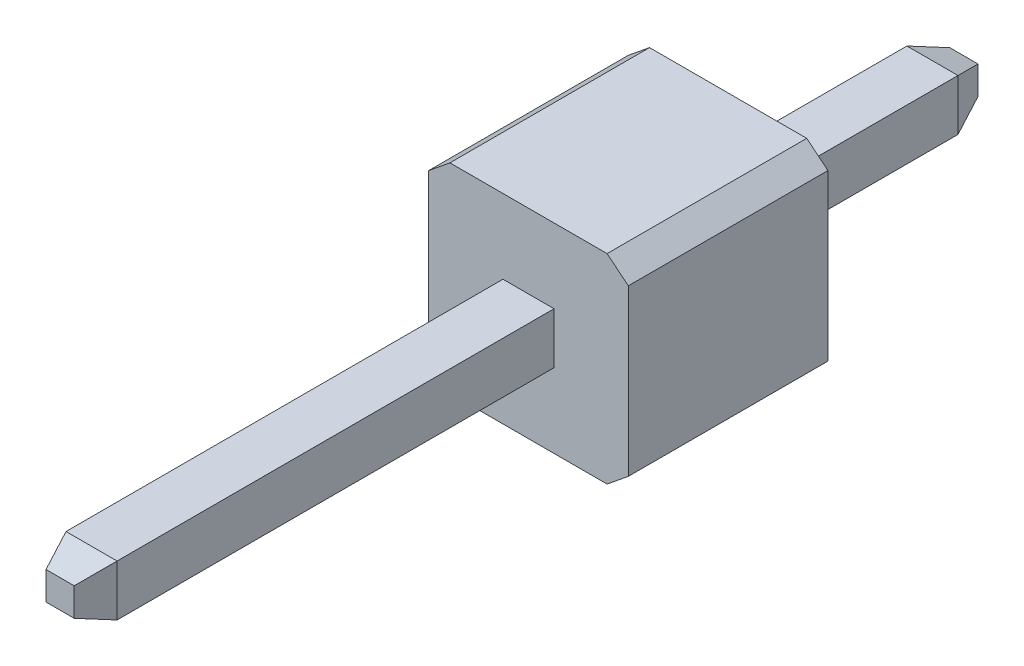
ISO-10303-21;
HEADER;
FILE_DESCRIPTION(('STEP AP214'),'2;1');
FILE_NAME('part.step','',(''),(''),'','','');
FILE_SCHEMA(('AUTOMOTIVE_DESIGN { 1 0 10303 214 1 1 1 1 }'));
ENDSEC;
DATA;
#1=APPLICATION_CONTEXT('core data for automotive mechanical design processes');
#2=APPLICATION_PROTOCOL_DEFINITION('international standard','automotive_design',2000,#1);
#3=PRODUCT_CONTEXT('',#1,'mechanical');
#4=PRODUCT('Part','Part','',(#3));
#5=PRODUCT_RELATED_PRODUCT_CATEGORY('part','',(#4));
#6=PRODUCT_DEFINITION_FORMATION('','',#4);
#7=PRODUCT_DEFINITION_CONTEXT('part definition',#1,'design');
#8=PRODUCT_DEFINITION('design','',#6,#7);
#9=PRODUCT_DEFINITION_SHAPE('','',#8);
#10=(LENGTH_UNIT() NAMED_UNIT(*) SI_UNIT(.MILLI.,.METRE.));
#11=(NAMED_UNIT(*) PLANE_ANGLE_UNIT() SI_UNIT($,.RADIAN.));
#12=(NAMED_UNIT(*) SI_UNIT($,.STERADIAN.) SOLID_ANGLE_UNIT());
#13=UNCERTAINTY_MEASURE_WITH_UNIT(LENGTH_MEASURE(1.E-05),#10,'distance_accuracy_value','');
#14=(GEOMETRIC_REPRESENTATION_CONTEXT(3) GLOBAL_UNCERTAINTY_ASSIGNED_CONTEXT((#13)) GLOBAL_UNIT_ASSIGNED_CONTEXT((#10,
#11,#12)) REPRESENTATION_CONTEXT('',''));
#15=CARTESIAN_POINT('',(0.,0.,0.));
#16=DIRECTION('',(0.,0.,1.));
#17=DIRECTION('',(1.,0.,0.));
#18=AXIS2_PLACEMENT_3D('',#15,#16,#17);
#19=CARTESIAN_POINT('',(-0.325,0.325,11.5));
#20=DIRECTION('',(1.,0.,0.));
#21=DIRECTION('',(0.,1.,0.));
#22=AXIS2_PLACEMENT_3D('',#19,#20,#21);
#23=PLANE('',#22);
#24=DIRECTION('',(0.,-1.,0.));
#25=VECTOR('',#24,1.);
#26=CARTESIAN_POINT('',(-0.325,0.325,3.));
#27=LINE('',#26,#25);
#28=CARTESIAN_POINT('',(-0.325,0.325,3.));
#29=VERTEX_POINT('',#28);
#30=CARTESIAN_POINT('',(-0.325,-0.325,3.));
#31=VERTEX_POINT('',#30);
#32=EDGE_CURVE('E239',#29,#31,#27,.T.);
#33=ORIENTED_EDGE('',*,*,#32,.F.);
#34=DIRECTION('',(0.,0.,-1.));
#35=VECTOR('',#34,1.);
#36=CARTESIAN_POINT('',(-0.325,0.325,11.5));
#37=LINE('',#36,#35);
#38=CARTESIAN_POINT('',(-0.325,0.325,0.4));
#39=VERTEX_POINT('',#38);
#40=EDGE_CURVE('E20',#29,#39,#37,.T.);
#41=ORIENTED_EDGE('',*,*,#40,.T.);
#42=DIRECTION('',(0.,-1.,0.));
#43=VECTOR('',#42,1.);
#44=CARTESIAN_POINT('',(-0.325,0.325,0.4));
#45=LINE('',#44,#43);
#46=CARTESIAN_POINT('',(-0.325,-0.325,0.4));
#47=VERTEX_POINT('',#46);
#48=EDGE_CURVE('E259',#39,#47,#45,.T.);
#49=ORIENTED_EDGE('',*,*,#48,.T.);
#50=DIRECTION('',(0.,0.,-1.));
#51=VECTOR('',#50,1.);
#52=CARTESIAN_POINT('',(-0.325,-0.325,11.5));
#53=LINE('',#52,#51);
#54=EDGE_CURVE('E11',#31,#47,#53,.T.);
#55=ORIENTED_EDGE('',*,*,#54,.F.);
#56=EDGE_LOOP('',(#33,#41,#49,#55));
#57=FACE_BOUND('',#56,.T.);
#58=ADVANCED_FACE('F16',(#57),#23,.F.);
#59=CARTESIAN_POINT('',(-0.325,-0.325,11.5));
#60=DIRECTION('',(0.,1.,0.));
#61=DIRECTION('',(1.,0.,0.));
#62=AXIS2_PLACEMENT_3D('',#59,#60,#61);
#63=PLANE('',#62);
#64=DIRECTION('',(1.,0.,0.));
#65=VECTOR('',#64,1.);
#66=CARTESIAN_POINT('',(-0.325,-0.325,3.));
#67=LINE('',#66,#65);
#68=CARTESIAN_POINT('',(0.325,-0.325,3.));
#69=VERTEX_POINT('',#68);
#70=EDGE_CURVE('E233',#31,#69,#67,.T.);
#71=ORIENTED_EDGE('',*,*,#70,.F.);
#72=ORIENTED_EDGE('',*,*,#54,.T.);
#73=DIRECTION('',(1.,0.,0.));
#74=VECTOR('',#73,1.);
#75=CARTESIAN_POINT('',(-0.325,-0.325,0.4));
#76=LINE('',#75,#74);
#77=CARTESIAN_POINT('',(0.325,-0.325,0.4));
#78=VERTEX_POINT('',#77);
#79=EDGE_CURVE('E385',#47,#78,#76,.T.);
#80=ORIENTED_EDGE('',*,*,#79,.T.);
#81=DIRECTION('',(0.,0.,-1.));
#82=VECTOR('',#81,1.);
#83=CARTESIAN_POINT('',(0.325,-0.325,11.5));
#84=LINE('',#83,#82);
#85=EDGE_CURVE('E27',#69,#78,#84,.T.);
#86=ORIENTED_EDGE('',*,*,#85,.F.);
#87=EDGE_LOOP('',(#71,#72,#80,#86));
#88=FACE_BOUND('',#87,.T.);
#89=ADVANCED_FACE('F464',(#88),#63,.F.);
#90=CARTESIAN_POINT('',(0.325,0.325,11.5));
#91=DIRECTION('',(-1.,0.,0.));
#92=DIRECTION('',(0.,1.,0.));
#93=AXIS2_PLACEMENT_3D('',#90,#91,#92);
#94=PLANE('',#93);
#95=DIRECTION('',(0.,1.,0.));
#96=VECTOR('',#95,1.);
#97=CARTESIAN_POINT('',(0.325,0.325,3.));
#98=LINE('',#97,#96);
#99=CARTESIAN_POINT('',(0.325,0.325,3.));
#100=VERTEX_POINT('',#99);
#101=EDGE_CURVE('E218',#69,#100,#98,.T.);
#102=ORIENTED_EDGE('',*,*,#101,.F.);
#103=ORIENTED_EDGE('',*,*,#85,.T.);
#104=DIRECTION('',(0.,1.,0.));
#105=VECTOR('',#104,1.);
#106=CARTESIAN_POINT('',(0.325,0.325,0.4));
#107=LINE('',#106,#105);
#108=CARTESIAN_POINT('',(0.325,0.325,0.4));
#109=VERTEX_POINT('',#108);
#110=EDGE_CURVE('E221',#78,#109,#107,.T.);
#111=ORIENTED_EDGE('',*,*,#110,.T.);
#112=DIRECTION('',(0.,0.,-1.));
#113=VECTOR('',#112,1.);
#114=CARTESIAN_POINT('',(0.325,0.325,11.5));
#115=LINE('',#114,#113);
#116=EDGE_CURVE('E41',#100,#109,#115,.T.);
#117=ORIENTED_EDGE('',*,*,#116,.F.);
#118=EDGE_LOOP('',(#102,#103,#111,#117));
#119=FACE_BOUND('',#118,.T.);
#120=ADVANCED_FACE('F217',(#119),#94,.F.);
#121=CARTESIAN_POINT('',(-0.325,0.325,11.5));
#122=DIRECTION('',(0.,-1.,0.));
#123=DIRECTION('',(0.,0.,-1.));
#124=AXIS2_PLACEMENT_3D('',#121,#122,#123);
#125=PLANE('',#124);
#126=DIRECTION('',(-1.,0.,0.));
#127=VECTOR('',#126,1.);
#128=CARTESIAN_POINT('',(-0.325,0.325,3.));
#129=LINE('',#128,#127);
#130=EDGE_CURVE('E231',#100,#29,#129,.T.);
#131=ORIENTED_EDGE('',*,*,#130,.F.);
#132=ORIENTED_EDGE('',*,*,#116,.T.);
#133=DIRECTION('',(-1.,0.,0.));
#134=VECTOR('',#133,1.);
#135=CARTESIAN_POINT('',(-0.325,0.325,0.4));
#136=LINE('',#135,#134);
#137=EDGE_CURVE('E224',#109,#39,#136,.T.);
#138=ORIENTED_EDGE('',*,*,#137,.T.);
#139=ORIENTED_EDGE('',*,*,#40,.F.);
#140=EDGE_LOOP('',(#131,#132,#138,#139));
#141=FACE_BOUND('',#140,.T.);
#142=ADVANCED_FACE('F237',(#141),#125,.F.);
#143=CARTESIAN_POINT('',(-0.325,0.325,0.4));
#144=DIRECTION('',(0.,-0.93969262078591,0.342020143325665));
#145=DIRECTION('',(-1.,0.,0.));
#146=AXIS2_PLACEMENT_3D('',#143,#144,#145);
#147=PLANE('',#146);
#148=DIRECTION('',(0.323615577118182,0.323615577118182,0.889126490715991));
#149=VECTOR('',#148,1.);
#150=CARTESIAN_POINT('',(0.256927422860203,0.256927422860203,0.212972131424324));
#151=LINE('',#150,#149);
#152=CARTESIAN_POINT('',(0.17941190629352,0.17941190629352,0.));
#153=VERTEX_POINT('',#152);
#154=EDGE_CURVE('E386',#153,#109,#151,.T.);
#155=ORIENTED_EDGE('',*,*,#154,.F.);
#156=DIRECTION('',(1.,0.,0.));
#157=VECTOR('',#156,1.);
#158=CARTESIAN_POINT('',(0.,0.17941190629352,0.));
#159=LINE('',#158,#157);
#160=CARTESIAN_POINT('',(-0.17941190629352,0.17941190629352,0.));
#161=VERTEX_POINT('',#160);
#162=EDGE_CURVE('E378',#161,#153,#159,.T.);
#163=ORIENTED_EDGE('',*,*,#162,.F.);
#164=DIRECTION('',(0.323615577118182,-0.323615577118182,-0.889126490715991));
#165=VECTOR('',#164,1.);
#166=CARTESIAN_POINT('',(-0.325,0.325,0.4));
#167=LINE('',#166,#165);
#168=EDGE_CURVE('E186',#39,#161,#167,.T.);
#169=ORIENTED_EDGE('',*,*,#168,.F.);
#170=ORIENTED_EDGE('',*,*,#137,.F.);
#171=EDGE_LOOP('',(#155,#163,#169,#170));
#172=FACE_BOUND('',#171,.T.);
#173=ADVANCED_FACE('F487',(#172),#147,.F.);
#174=CARTESIAN_POINT('',(0.325,0.325,0.4));
#175=DIRECTION('',(-0.93969262078591,0.,0.342020143325665));
#176=DIRECTION('',(0.,1.,0.));
#177=AXIS2_PLACEMENT_3D('',#174,#175,#176);
#178=PLANE('',#177);
#179=ORIENTED_EDGE('',*,*,#154,.T.);
#180=ORIENTED_EDGE('',*,*,#110,.F.);
#181=DIRECTION('',(0.323615577118182,-0.323615577118182,0.889126490715991));
#182=VECTOR('',#181,1.);
#183=CARTESIAN_POINT('',(0.256927422860203,-0.256927422860203,0.212972131424324));
#184=LINE('',#183,#182);
#185=CARTESIAN_POINT('',(0.179411906293521,-0.17941190629352,0.));
#186=VERTEX_POINT('',#185);
#187=EDGE_CURVE('E262',#186,#78,#184,.T.);
#188=ORIENTED_EDGE('',*,*,#187,.F.);
#189=DIRECTION('',(0.,-1.,0.));
#190=VECTOR('',#189,1.);
#191=CARTESIAN_POINT('',(0.17941190629352,0.,0.));
#192=LINE('',#191,#190);
#193=EDGE_CURVE('E253',#153,#186,#192,.T.);
#194=ORIENTED_EDGE('',*,*,#193,.F.);
#195=EDGE_LOOP('',(#179,#180,#188,#194));
#196=FACE_BOUND('',#195,.T.);
#197=ADVANCED_FACE('F484',(#196),#178,.F.);
#198=CARTESIAN_POINT('',(-0.325,-0.325,0.4));
#199=DIRECTION('',(0.,0.93969262078591,0.342020143325665));
#200=DIRECTION('',(1.,0.,0.));
#201=AXIS2_PLACEMENT_3D('',#198,#199,#200);
#202=PLANE('',#201);
#203=DIRECTION('',(0.323615577118182,0.323615577118182,-0.889126490715991));
#204=VECTOR('',#203,1.);
#205=CARTESIAN_POINT('',(-0.256927422860203,-0.256927422860203,0.212972131424324));
#206=LINE('',#205,#204);
#207=CARTESIAN_POINT('',(-0.17941190629352,-0.17941190629352,0.));
#208=VERTEX_POINT('',#207);
#209=EDGE_CURVE('E177',#47,#208,#206,.T.);
#210=ORIENTED_EDGE('',*,*,#209,.T.);
#211=DIRECTION('',(-1.,0.,0.));
#212=VECTOR('',#211,1.);
#213=CARTESIAN_POINT('',(0.,-0.17941190629352,0.));
#214=LINE('',#213,#212);
#215=EDGE_CURVE('E257',#186,#208,#214,.T.);
#216=ORIENTED_EDGE('',*,*,#215,.F.);
#217=ORIENTED_EDGE('',*,*,#187,.T.);
#218=ORIENTED_EDGE('',*,*,#79,.F.);
#219=EDGE_LOOP('',(#210,#216,#217,#218));
#220=FACE_BOUND('',#219,.T.);
#221=ADVANCED_FACE('F471',(#220),#202,.F.);
#222=CARTESIAN_POINT('',(-0.325,0.325,0.4));
#223=DIRECTION('',(0.93969262078591,0.,0.342020143325665));
#224=DIRECTION('',(0.,-1.,0.));
#225=AXIS2_PLACEMENT_3D('',#222,#223,#224);
#226=PLANE('',#225);
#227=ORIENTED_EDGE('',*,*,#168,.T.);
#228=DIRECTION('',(0.,1.,0.));
#229=VECTOR('',#228,1.);
#230=CARTESIAN_POINT('',(-0.17941190629352,0.,0.));
#231=LINE('',#230,#229);
#232=EDGE_CURVE('E426',#208,#161,#231,.T.);
#233=ORIENTED_EDGE('',*,*,#232,.F.);
#234=ORIENTED_EDGE('',*,*,#209,.F.);
#235=ORIENTED_EDGE('',*,*,#48,.F.);
#236=EDGE_LOOP('',(#227,#233,#234,#235));
#237=FACE_BOUND('',#236,.T.);
#238=ADVANCED_FACE('F18',(#237),#226,.F.);
#239=CARTESIAN_POINT('',(0.,0.,0.));
#240=DIRECTION('',(0.,0.,1.));
#241=DIRECTION('',(1.,0.,0.));
#242=AXIS2_PLACEMENT_3D('',#239,#240,#241);
#243=PLANE('',#242);
#244=ORIENTED_EDGE('',*,*,#193,.T.);
#245=ORIENTED_EDGE('',*,*,#215,.T.);
#246=ORIENTED_EDGE('',*,*,#232,.T.);
#247=ORIENTED_EDGE('',*,*,#162,.T.);
#248=EDGE_LOOP('',(#244,#245,#246,#247));
#249=FACE_BOUND('',#248,.T.);
#250=ADVANCED_FACE('F504',(#249),#243,.F.);
#251=CARTESIAN_POINT('',(1.27,-1.05,5.54));
#252=DIRECTION('',(1.,0.,0.));
#253=DIRECTION('',(0.,1.,0.));
#254=AXIS2_PLACEMENT_3D('',#251,#252,#253);
#255=PLANE('',#254);
#256=DIRECTION('',(0.,-1.,0.));
#257=VECTOR('',#256,1.);
#258=CARTESIAN_POINT('',(1.27,-1.05,3.));
#259=LINE('',#258,#257);
#260=CARTESIAN_POINT('',(1.27,1.05,3.));
#261=VERTEX_POINT('',#260);
#262=CARTESIAN_POINT('',(1.27,-1.05,3.));
#263=VERTEX_POINT('',#262);
#264=EDGE_CURVE('E315',#261,#263,#259,.T.);
#265=ORIENTED_EDGE('',*,*,#264,.F.);
#266=DIRECTION('',(0.,0.,-1.));
#267=VECTOR('',#266,1.);
#268=CARTESIAN_POINT('',(1.27,1.05,5.54));
#269=LINE('',#268,#267);
#270=CARTESIAN_POINT('',(1.27,1.05,5.54));
#271=VERTEX_POINT('',#270);
#272=EDGE_CURVE('E430',#271,#261,#269,.T.);
#273=ORIENTED_EDGE('',*,*,#272,.F.);
#274=DIRECTION('',(0.,-1.,0.));
#275=VECTOR('',#274,1.);
#276=CARTESIAN_POINT('',(1.27,-1.05,5.54));
#277=LINE('',#276,#275);
#278=CARTESIAN_POINT('',(1.27,-1.05,5.54));
#279=VERTEX_POINT('',#278);
#280=EDGE_CURVE('E371',#271,#279,#277,.T.);
#281=ORIENTED_EDGE('',*,*,#280,.T.);
#282=DIRECTION('',(0.,0.,-1.));
#283=VECTOR('',#282,1.);
#284=CARTESIAN_POINT('',(1.27,-1.05,5.54));
#285=LINE('',#284,#283);
#286=EDGE_CURVE('E258',#279,#263,#285,.T.);
#287=ORIENTED_EDGE('',*,*,#286,.T.);
#288=EDGE_LOOP('',(#265,#273,#281,#287));
#289=FACE_BOUND('',#288,.T.);
#290=ADVANCED_FACE('F500',(#289),#255,.T.);
#291=CARTESIAN_POINT('',(1.,-1.27,5.54));
#292=DIRECTION('',(0.631672951162235,-0.77523498551729,0.));
#293=DIRECTION('',(0.,0.,-1.));
#294=AXIS2_PLACEMENT_3D('',#291,#292,#293);
#295=PLANE('',#294);
#296=DIRECTION('',(-0.77523498551729,-0.631672951162235,0.));
#297=VECTOR('',#296,1.);
#298=CARTESIAN_POINT('',(1.,-1.27,3.));
#299=LINE('',#298,#297);
#300=CARTESIAN_POINT('',(1.,-1.27,3.));
#301=VERTEX_POINT('',#300);
#302=EDGE_CURVE('E310',#263,#301,#299,.T.);
#303=ORIENTED_EDGE('',*,*,#302,.F.);
#304=ORIENTED_EDGE('',*,*,#286,.F.);
#305=DIRECTION('',(-0.77523498551729,-0.631672951162235,0.));
#306=VECTOR('',#305,1.);
#307=CARTESIAN_POINT('',(1.,-1.27,5.54));
#308=LINE('',#307,#306);
#309=CARTESIAN_POINT('',(1.,-1.27,5.54));
#310=VERTEX_POINT('',#309);
#311=EDGE_CURVE('E291',#279,#310,#308,.T.);
#312=ORIENTED_EDGE('',*,*,#311,.T.);
#313=DIRECTION('',(0.,0.,-1.));
#314=VECTOR('',#313,1.);
#315=CARTESIAN_POINT('',(1.,-1.27,5.54));
#316=LINE('',#315,#314);
#317=EDGE_CURVE('E300',#310,#301,#316,.T.);
#318=ORIENTED_EDGE('',*,*,#317,.T.);
#319=EDGE_LOOP('',(#303,#304,#312,#318));
#320=FACE_BOUND('',#319,.T.);
#321=ADVANCED_FACE('F503',(#320),#295,.T.);
#322=CARTESIAN_POINT('',(-1.,-1.27,5.54));
#323=DIRECTION('',(0.,-1.,0.));
#324=DIRECTION('',(0.,0.,-1.));
#325=AXIS2_PLACEMENT_3D('',#322,#323,#324);
#326=PLANE('',#325);
#327=DIRECTION('',(-1.,0.,0.));
#328=VECTOR('',#327,1.);
#329=CARTESIAN_POINT('',(-1.,-1.27,3.));
#330=LINE('',#329,#328);
#331=CARTESIAN_POINT('',(-1.,-1.27,3.));
#332=VERTEX_POINT('',#331);
#333=EDGE_CURVE('E314',#301,#332,#330,.T.);
#334=ORIENTED_EDGE('',*,*,#333,.F.);
#335=ORIENTED_EDGE('',*,*,#317,.F.);
#336=DIRECTION('',(-1.,0.,0.));
#337=VECTOR('',#336,1.);
#338=CARTESIAN_POINT('',(-1.,-1.27,5.54));
#339=LINE('',#338,#337);
#340=CARTESIAN_POINT('',(-1.,-1.27,5.54));
#341=VERTEX_POINT('',#340);
#342=EDGE_CURVE('E287',#310,#341,#339,.T.);
#343=ORIENTED_EDGE('',*,*,#342,.T.);
#344=DIRECTION('',(0.,0.,-1.));
#345=VECTOR('',#344,1.);
#346=CARTESIAN_POINT('',(-1.,-1.27,5.54));
#347=LINE('',#346,#345);
#348=EDGE_CURVE('E318',#341,#332,#347,.T.);
#349=ORIENTED_EDGE('',*,*,#348,.T.);
#350=EDGE_LOOP('',(#334,#335,#343,#349));
#351=FACE_BOUND('',#350,.T.);
#352=ADVANCED_FACE('F506',(#351),#326,.T.);
#353=CARTESIAN_POINT('',(-1.27,-1.05,5.54));
#354=DIRECTION('',(-0.631672951162236,-0.775234985517289,0.));
#355=DIRECTION('',(-0.775234985517289,0.631672951162236,0.));
#356=AXIS2_PLACEMENT_3D('',#353,#354,#355);
#357=PLANE('',#356);
#358=DIRECTION('',(-0.77523498551729,0.631672951162235,0.));
#359=VECTOR('',#358,1.);
#360=CARTESIAN_POINT('',(-1.27,-1.05,3.));
#361=LINE('',#360,#359);
#362=CARTESIAN_POINT('',(-1.27,-1.05,3.));
#363=VERTEX_POINT('',#362);
#364=EDGE_CURVE('E366',#332,#363,#361,.T.);
#365=ORIENTED_EDGE('',*,*,#364,.F.);
#366=ORIENTED_EDGE('',*,*,#348,.F.);
#367=DIRECTION('',(-0.77523498551729,0.631672951162235,0.));
#368=VECTOR('',#367,1.);
#369=CARTESIAN_POINT('',(-1.27,-1.05,5.54));
#370=LINE('',#369,#368);
#371=CARTESIAN_POINT('',(-1.27,-1.05,5.54));
#372=VERTEX_POINT('',#371);
#373=EDGE_CURVE('E292',#341,#372,#370,.T.);
#374=ORIENTED_EDGE('',*,*,#373,.T.);
#375=DIRECTION('',(0.,0.,-1.));
#376=VECTOR('',#375,1.);
#377=CARTESIAN_POINT('',(-1.27,-1.05,5.54));
#378=LINE('',#377,#376);
#379=EDGE_CURVE('E332',#372,#363,#378,.T.);
#380=ORIENTED_EDGE('',*,*,#379,.T.);
#381=EDGE_LOOP('',(#365,#366,#374,#380));
#382=FACE_BOUND('',#381,.T.);
#383=ADVANCED_FACE('F491',(#382),#357,.T.);
#384=CARTESIAN_POINT('',(-1.27,1.05,5.54));
#385=DIRECTION('',(-1.,0.,0.));
#386=DIRECTION('',(0.,0.,1.));
#387=AXIS2_PLACEMENT_3D('',#384,#385,#386);
#388=PLANE('',#387);
#389=DIRECTION('',(0.,1.,0.));
#390=VECTOR('',#389,1.);
#391=CARTESIAN_POINT('',(-1.27,1.05,3.));
#392=LINE('',#391,#390);
#393=CARTESIAN_POINT('',(-1.27,1.05,3.));
#394=VERTEX_POINT('',#393);
#395=EDGE_CURVE('E401',#363,#394,#392,.T.);
#396=ORIENTED_EDGE('',*,*,#395,.F.);
#397=ORIENTED_EDGE('',*,*,#379,.F.);
#398=DIRECTION('',(0.,1.,0.));
#399=VECTOR('',#398,1.);
#400=CARTESIAN_POINT('',(-1.27,1.05,5.54));
#401=LINE('',#400,#399);
#402=CARTESIAN_POINT('',(-1.27,1.05,5.54));
#403=VERTEX_POINT('',#402);
#404=EDGE_CURVE('E285',#372,#403,#401,.T.);
#405=ORIENTED_EDGE('',*,*,#404,.T.);
#406=DIRECTION('',(0.,0.,-1.));
#407=VECTOR('',#406,1.);
#408=CARTESIAN_POINT('',(-1.27,1.05,5.54));
#409=LINE('',#408,#407);
#410=EDGE_CURVE('E329',#403,#394,#409,.T.);
#411=ORIENTED_EDGE('',*,*,#410,.T.);
#412=EDGE_LOOP('',(#396,#397,#405,#411));
#413=FACE_BOUND('',#412,.T.);
#414=ADVANCED_FACE('F488',(#413),#388,.T.);
#415=CARTESIAN_POINT('',(-1.,1.27,5.54));
#416=DIRECTION('',(-0.631672951162236,0.775234985517289,0.));
#417=DIRECTION('',(0.,0.,1.));
#418=AXIS2_PLACEMENT_3D('',#415,#416,#417);
#419=PLANE('',#418);
#420=DIRECTION('',(0.77523498551729,0.631672951162236,0.));
#421=VECTOR('',#420,1.);
#422=CARTESIAN_POINT('',(-1.,1.27,3.));
#423=LINE('',#422,#421);
#424=CARTESIAN_POINT('',(-1.,1.27,3.));
#425=VERTEX_POINT('',#424);
#426=EDGE_CURVE('E249',#394,#425,#423,.T.);
#427=ORIENTED_EDGE('',*,*,#426,.F.);
#428=ORIENTED_EDGE('',*,*,#410,.F.);
#429=DIRECTION('',(0.77523498551729,0.631672951162236,0.));
#430=VECTOR('',#429,1.);
#431=CARTESIAN_POINT('',(-1.,1.27,5.54));
#432=LINE('',#431,#430);
#433=CARTESIAN_POINT('',(-1.,1.27,5.54));
#434=VERTEX_POINT('',#433);
#435=EDGE_CURVE('E281',#403,#434,#432,.T.);
#436=ORIENTED_EDGE('',*,*,#435,.T.);
#437=DIRECTION('',(0.,0.,-1.));
#438=VECTOR('',#437,1.);
#439=CARTESIAN_POINT('',(-1.,1.27,5.54));
#440=LINE('',#439,#438);
#441=EDGE_CURVE('E333',#434,#425,#440,.T.);
#442=ORIENTED_EDGE('',*,*,#441,.T.);
#443=EDGE_LOOP('',(#427,#428,#436,#442));
#444=FACE_BOUND('',#443,.T.);
#445=ADVANCED_FACE('F439',(#444),#419,.T.);
#446=CARTESIAN_POINT('',(1.,1.27,5.54));
#447=DIRECTION('',(0.,1.,0.));
#448=DIRECTION('',(1.,0.,0.));
#449=AXIS2_PLACEMENT_3D('',#446,#447,#448);
#450=PLANE('',#449);
#451=DIRECTION('',(1.,0.,0.));
#452=VECTOR('',#451,1.);
#453=CARTESIAN_POINT('',(1.,1.27,3.));
#454=LINE('',#453,#452);
#455=CARTESIAN_POINT('',(1.,1.27,3.));
#456=VERTEX_POINT('',#455);
#457=EDGE_CURVE('E240',#425,#456,#454,.T.);
#458=ORIENTED_EDGE('',*,*,#457,.F.);
#459=ORIENTED_EDGE('',*,*,#441,.F.);
#460=DIRECTION('',(1.,0.,0.));
#461=VECTOR('',#460,1.);
#462=CARTESIAN_POINT('',(1.,1.27,5.54));
#463=LINE('',#462,#461);
#464=CARTESIAN_POINT('',(1.,1.27,5.54));
#465=VERTEX_POINT('',#464);
#466=EDGE_CURVE('E286',#434,#465,#463,.T.);
#467=ORIENTED_EDGE('',*,*,#466,.T.);
#468=DIRECTION('',(0.,0.,-1.));
#469=VECTOR('',#468,1.);
#470=CARTESIAN_POINT('',(1.,1.27,5.54));
#471=LINE('',#470,#469);
#472=EDGE_CURVE('E235',#465,#456,#471,.T.);
#473=ORIENTED_EDGE('',*,*,#472,.T.);
#474=EDGE_LOOP('',(#458,#459,#467,#473));
#475=FACE_BOUND('',#474,.T.);
#476=ADVANCED_FACE('F443',(#475),#450,.T.);
#477=CARTESIAN_POINT('',(1.27,1.05,5.54));
#478=DIRECTION('',(0.631672951162236,0.775234985517289,0.));
#479=DIRECTION('',(0.,0.,-1.));
#480=AXIS2_PLACEMENT_3D('',#477,#478,#479);
#481=PLANE('',#480);
#482=DIRECTION('',(0.775234985517289,-0.631672951162236,0.));
#483=VECTOR('',#482,1.);
#484=CARTESIAN_POINT('',(1.27,1.05,3.));
#485=LINE('',#484,#483);
#486=EDGE_CURVE('E375',#456,#261,#485,.T.);
#487=ORIENTED_EDGE('',*,*,#486,.F.);
#488=ORIENTED_EDGE('',*,*,#472,.F.);
#489=DIRECTION('',(0.775234985517289,-0.631672951162236,0.));
#490=VECTOR('',#489,1.);
#491=CARTESIAN_POINT('',(1.27,1.05,5.54));
#492=LINE('',#491,#490);
#493=EDGE_CURVE('E308',#465,#271,#492,.T.);
#494=ORIENTED_EDGE('',*,*,#493,.T.);
#495=ORIENTED_EDGE('',*,*,#272,.T.);
#496=EDGE_LOOP('',(#487,#488,#494,#495));
#497=FACE_BOUND('',#496,.T.);
#498=ADVANCED_FACE('F449',(#497),#481,.T.);
#499=CARTESIAN_POINT('',(0.,0.,3.));
#500=DIRECTION('',(0.,0.,1.));
#501=DIRECTION('',(1.,0.,0.));
#502=AXIS2_PLACEMENT_3D('',#499,#500,#501);
#503=PLANE('',#502);
#504=ORIENTED_EDGE('',*,*,#130,.T.);
#505=ORIENTED_EDGE('',*,*,#32,.T.);
#506=ORIENTED_EDGE('',*,*,#70,.T.);
#507=ORIENTED_EDGE('',*,*,#101,.T.);
#508=EDGE_LOOP('',(#504,#505,#506,#507));
#509=FACE_BOUND('',#508,.T.);
#510=ORIENTED_EDGE('',*,*,#486,.T.);
#511=ORIENTED_EDGE('',*,*,#264,.T.);
#512=ORIENTED_EDGE('',*,*,#302,.T.);
#513=ORIENTED_EDGE('',*,*,#333,.T.);
#514=ORIENTED_EDGE('',*,*,#364,.T.);
#515=ORIENTED_EDGE('',*,*,#395,.T.);
#516=ORIENTED_EDGE('',*,*,#426,.T.);
#517=ORIENTED_EDGE('',*,*,#457,.T.);
#518=EDGE_LOOP('',(#510,#511,#512,#513,#514,#515,#516,#517));
#519=FACE_BOUND('',#518,.T.);
#520=ADVANCED_FACE('F228',(#509,#519),#503,.F.);
#521=CARTESIAN_POINT('',(0.,0.,5.54));
#522=DIRECTION('',(0.,0.,1.));
#523=DIRECTION('',(1.,0.,0.));
#524=AXIS2_PLACEMENT_3D('',#521,#522,#523);
#525=PLANE('',#524);
#526=DIRECTION('',(0.,-1.,0.));
#527=VECTOR('',#526,1.);
#528=CARTESIAN_POINT('',(-0.325,0.325,5.54));
#529=LINE('',#528,#527);
#530=CARTESIAN_POINT('',(-0.325,0.325,5.54));
#531=VERTEX_POINT('',#530);
#532=CARTESIAN_POINT('',(-0.325,-0.325,5.54));
#533=VERTEX_POINT('',#532);
#534=EDGE_CURVE('E323',#531,#533,#529,.T.);
#535=ORIENTED_EDGE('',*,*,#534,.F.);
#536=DIRECTION('',(-1.,0.,0.));
#537=VECTOR('',#536,1.);
#538=CARTESIAN_POINT('',(-0.325,0.325,5.54));
#539=LINE('',#538,#537);
#540=CARTESIAN_POINT('',(0.325,0.325,5.54));
#541=VERTEX_POINT('',#540);
#542=EDGE_CURVE('E268',#541,#531,#539,.T.);
#543=ORIENTED_EDGE('',*,*,#542,.F.);
#544=DIRECTION('',(0.,1.,0.));
#545=VECTOR('',#544,1.);
#546=CARTESIAN_POINT('',(0.325,0.325,5.54));
#547=LINE('',#546,#545);
#548=CARTESIAN_POINT('',(0.325,-0.325,5.54));
#549=VERTEX_POINT('',#548);
#550=EDGE_CURVE('E297',#549,#541,#547,.T.);
#551=ORIENTED_EDGE('',*,*,#550,.F.);
#552=DIRECTION('',(1.,0.,0.));
#553=VECTOR('',#552,1.);
#554=CARTESIAN_POINT('',(-0.325,-0.325,5.54));
#555=LINE('',#554,#553);
#556=EDGE_CURVE('E269',#533,#549,#555,.T.);
#557=ORIENTED_EDGE('',*,*,#556,.F.);
#558=EDGE_LOOP('',(#535,#543,#551,#557));
#559=FACE_BOUND('',#558,.T.);
#560=ORIENTED_EDGE('',*,*,#493,.F.);
#561=ORIENTED_EDGE('',*,*,#466,.F.);
#562=ORIENTED_EDGE('',*,*,#435,.F.);
#563=ORIENTED_EDGE('',*,*,#404,.F.);
#564=ORIENTED_EDGE('',*,*,#373,.F.);
#565=ORIENTED_EDGE('',*,*,#342,.F.);
#566=ORIENTED_EDGE('',*,*,#311,.F.);
#567=ORIENTED_EDGE('',*,*,#280,.F.);
#568=EDGE_LOOP('',(#560,#561,#562,#563,#564,#565,#566,#567));
#569=FACE_BOUND('',#568,.T.);
#570=ADVANCED_FACE('F448',(#559,#569),#525,.T.);
#571=CARTESIAN_POINT('',(0.,0.17941190629352,11.5));
#572=DIRECTION('',(0.,0.939692620785909,0.342020143325667));
#573=DIRECTION('',(1.,0.,0.));
#574=AXIS2_PLACEMENT_3D('',#571,#572,#573);
#575=PLANE('',#574);
#576=DIRECTION('',(0.323615577118183,0.323615577118183,-0.88912649071599));
#577=VECTOR('',#576,1.);
#578=CARTESIAN_POINT('',(0.160622628092037,0.160622628092037,11.5516231175864));
#579=LINE('',#578,#577);
#580=CARTESIAN_POINT('',(0.17941190629352,0.17941190629352,11.5));
#581=VERTEX_POINT('',#580);
#582=CARTESIAN_POINT('',(0.325,0.325,11.1));
#583=VERTEX_POINT('',#582);
#584=EDGE_CURVE('E309',#581,#583,#579,.T.);
#585=ORIENTED_EDGE('',*,*,#584,.T.);
#586=DIRECTION('',(1.,0.,0.));
#587=VECTOR('',#586,1.);
#588=CARTESIAN_POINT('',(0.325,0.325,11.1));
#589=LINE('',#588,#587);
#590=CARTESIAN_POINT('',(-0.325,0.325,11.1));
#591=VERTEX_POINT('',#590);
#592=EDGE_CURVE('E263',#591,#583,#589,.T.);
#593=ORIENTED_EDGE('',*,*,#592,.F.);
#594=DIRECTION('',(0.323615577118183,-0.323615577118183,0.88912649071599));
#595=VECTOR('',#594,1.);
#596=CARTESIAN_POINT('',(-0.160622628092037,0.160622628092037,11.5516231175864));
#597=LINE('',#596,#595);
#598=CARTESIAN_POINT('',(-0.17941190629352,0.17941190629352,11.5));
#599=VERTEX_POINT('',#598);
#600=EDGE_CURVE('E106',#591,#599,#597,.T.);
#601=ORIENTED_EDGE('',*,*,#600,.T.);
#602=DIRECTION('',(-1.,0.,0.));
#603=VECTOR('',#602,1.);
#604=CARTESIAN_POINT('',(-0.325,0.17941190629352,11.5));
#605=LINE('',#604,#603);
#606=EDGE_CURVE('E280',#581,#599,#605,.T.);
#607=ORIENTED_EDGE('',*,*,#606,.F.);
#608=EDGE_LOOP('',(#585,#593,#601,#607));
#609=FACE_BOUND('',#608,.T.);
#610=ADVANCED_FACE('F456',(#609),#575,.T.);
#611=CARTESIAN_POINT('',(-0.17941190629352,0.,11.5));
#612=DIRECTION('',(-0.939692620785909,0.,0.342020143325667));
#613=DIRECTION('',(0.,1.,0.));
#614=AXIS2_PLACEMENT_3D('',#611,#612,#613);
#615=PLANE('',#614);
#616=DIRECTION('',(0.323615577118183,0.323615577118183,0.88912649071599));
#617=VECTOR('',#616,1.);
#618=CARTESIAN_POINT('',(-0.160622628092037,-0.160622628092037,11.5516231175864));
#619=LINE('',#618,#617);
#620=CARTESIAN_POINT('',(-0.325,-0.325,11.1));
#621=VERTEX_POINT('',#620);
#622=CARTESIAN_POINT('',(-0.17941190629352,-0.17941190629352,11.5));
#623=VERTEX_POINT('',#622);
#624=EDGE_CURVE('E92',#621,#623,#619,.T.);
#625=ORIENTED_EDGE('',*,*,#624,.T.);
#626=DIRECTION('',(0.,-1.,0.));
#627=VECTOR('',#626,1.);
#628=CARTESIAN_POINT('',(-0.17941190629352,-0.325,11.5));
#629=LINE('',#628,#627);
#630=EDGE_CURVE('E305',#599,#623,#629,.T.);
#631=ORIENTED_EDGE('',*,*,#630,.F.);
#632=ORIENTED_EDGE('',*,*,#600,.F.);
#633=DIRECTION('',(0.,1.,0.));
#634=VECTOR('',#633,1.);
#635=CARTESIAN_POINT('',(-0.325,0.325,11.1));
#636=LINE('',#635,#634);
#637=EDGE_CURVE('E274',#621,#591,#636,.T.);
#638=ORIENTED_EDGE('',*,*,#637,.F.);
#639=EDGE_LOOP('',(#625,#631,#632,#638));
#640=FACE_BOUND('',#639,.T.);
#641=ADVANCED_FACE('F477',(#640),#615,.T.);
#642=CARTESIAN_POINT('',(0.17941190629352,0.,11.5));
#643=DIRECTION('',(0.939692620785909,0.,0.342020143325667));
#644=DIRECTION('',(0.,-1.,0.));
#645=AXIS2_PLACEMENT_3D('',#642,#643,#644);
#646=PLANE('',#645);
#647=DIRECTION('',(0.323615577118183,-0.323615577118183,-0.88912649071599));
#648=VECTOR('',#647,1.);
#649=CARTESIAN_POINT('',(0.160622628092037,-0.160622628092037,11.5516231175864));
#650=LINE('',#649,#648);
#651=CARTESIAN_POINT('',(0.17941190629352,-0.17941190629352,11.5));
#652=VERTEX_POINT('',#651);
#653=CARTESIAN_POINT('',(0.325,-0.325,11.1));
#654=VERTEX_POINT('',#653);
#655=EDGE_CURVE('E535',#652,#654,#650,.T.);
#656=ORIENTED_EDGE('',*,*,#655,.T.);
#657=DIRECTION('',(0.,-1.,0.));
#658=VECTOR('',#657,1.);
#659=CARTESIAN_POINT('',(0.325,-0.325,11.1));
#660=LINE('',#659,#658);
#661=EDGE_CURVE('E345',#583,#654,#660,.T.);
#662=ORIENTED_EDGE('',*,*,#661,.F.);
#663=ORIENTED_EDGE('',*,*,#584,.F.);
#664=DIRECTION('',(0.,1.,0.));
#665=VECTOR('',#664,1.);
#666=CARTESIAN_POINT('',(0.17941190629352,0.325,11.5));
#667=LINE('',#666,#665);
#668=EDGE_CURVE('E267',#652,#581,#667,.T.);
#669=ORIENTED_EDGE('',*,*,#668,.F.);
#670=EDGE_LOOP('',(#656,#662,#663,#669));
#671=FACE_BOUND('',#670,.T.);
#672=ADVANCED_FACE('F473',(#671),#646,.T.);
#673=CARTESIAN_POINT('',(0.,-0.17941190629352,11.5));
#674=DIRECTION('',(0.,-0.939692620785909,0.342020143325667));
#675=DIRECTION('',(-1.,0.,0.));
#676=AXIS2_PLACEMENT_3D('',#673,#674,#675);
#677=PLANE('',#676);
#678=ORIENTED_EDGE('',*,*,#624,.F.);
#679=DIRECTION('',(-1.,0.,0.));
#680=VECTOR('',#679,1.);
#681=CARTESIAN_POINT('',(-0.325,-0.325,11.1));
#682=LINE('',#681,#680);
#683=EDGE_CURVE('E293',#654,#621,#682,.T.);
#684=ORIENTED_EDGE('',*,*,#683,.F.);
#685=ORIENTED_EDGE('',*,*,#655,.F.);
#686=DIRECTION('',(1.,0.,0.));
#687=VECTOR('',#686,1.);
#688=CARTESIAN_POINT('',(0.325,-0.17941190629352,11.5));
#689=LINE('',#688,#687);
#690=EDGE_CURVE('E301',#623,#652,#689,.T.);
#691=ORIENTED_EDGE('',*,*,#690,.F.);
#692=EDGE_LOOP('',(#678,#684,#685,#691));
#693=FACE_BOUND('',#692,.T.);
#694=ADVANCED_FACE('F476',(#693),#677,.T.);
#695=CARTESIAN_POINT('',(0.,0.,11.5));
#696=DIRECTION('',(0.,0.,1.));
#697=DIRECTION('',(1.,0.,0.));
#698=AXIS2_PLACEMENT_3D('',#695,#696,#697);
#699=PLANE('',#698);
#700=ORIENTED_EDGE('',*,*,#668,.T.);
#701=ORIENTED_EDGE('',*,*,#606,.T.);
#702=ORIENTED_EDGE('',*,*,#630,.T.);
#703=ORIENTED_EDGE('',*,*,#690,.T.);
#704=EDGE_LOOP('',(#700,#701,#702,#703));
#705=FACE_BOUND('',#704,.T.);
#706=ADVANCED_FACE('F703',(#705),#699,.T.);
#707=CARTESIAN_POINT('',(-0.325,0.325,11.5));
#708=DIRECTION('',(0.,-1.,0.));
#709=DIRECTION('',(0.,0.,-1.));
#710=AXIS2_PLACEMENT_3D('',#707,#708,#709);
#711=PLANE('',#710);
#712=DIRECTION('',(0.,0.,-1.));
#713=VECTOR('',#712,1.);
#714=CARTESIAN_POINT('',(0.325,0.325,11.5));
#715=LINE('',#714,#713);
#716=EDGE_CURVE('E354',#583,#541,#715,.T.);
#717=ORIENTED_EDGE('',*,*,#716,.T.);
#718=ORIENTED_EDGE('',*,*,#542,.T.);
#719=DIRECTION('',(0.,0.,-1.));
#720=VECTOR('',#719,1.);
#721=CARTESIAN_POINT('',(-0.325,0.325,11.5));
#722=LINE('',#721,#720);
#723=EDGE_CURVE('E335',#591,#531,#722,.T.);
#724=ORIENTED_EDGE('',*,*,#723,.F.);
#725=ORIENTED_EDGE('',*,*,#592,.T.);
#726=EDGE_LOOP('',(#717,#718,#724,#725));
#727=FACE_BOUND('',#726,.T.);
#728=ADVANCED_FACE('F571',(#727),#711,.F.);
#729=CARTESIAN_POINT('',(0.325,0.325,11.5));
#730=DIRECTION('',(-1.,0.,0.));
#731=DIRECTION('',(0.,1.,0.));
#732=AXIS2_PLACEMENT_3D('',#729,#730,#731);
#733=PLANE('',#732);
#734=DIRECTION('',(0.,0.,-1.));
#735=VECTOR('',#734,1.);
#736=CARTESIAN_POINT('',(0.325,-0.325,11.5));
#737=LINE('',#736,#735);
#738=EDGE_CURVE('E273',#654,#549,#737,.T.);
#739=ORIENTED_EDGE('',*,*,#738,.T.);
#740=ORIENTED_EDGE('',*,*,#550,.T.);
#741=ORIENTED_EDGE('',*,*,#716,.F.);
#742=ORIENTED_EDGE('',*,*,#661,.T.);
#743=EDGE_LOOP('',(#739,#740,#741,#742));
#744=FACE_BOUND('',#743,.T.);
#745=ADVANCED_FACE('F572',(#744),#733,.F.);
#746=CARTESIAN_POINT('',(-0.325,-0.325,11.5));
#747=DIRECTION('',(0.,1.,0.));
#748=DIRECTION('',(1.,0.,0.));
#749=AXIS2_PLACEMENT_3D('',#746,#747,#748);
#750=PLANE('',#749);
#751=DIRECTION('',(0.,0.,-1.));
#752=VECTOR('',#751,1.);
#753=CARTESIAN_POINT('',(-0.325,-0.325,11.5));
#754=LINE('',#753,#752);
#755=EDGE_CURVE('E319',#621,#533,#754,.T.);
#756=ORIENTED_EDGE('',*,*,#755,.T.);
#757=ORIENTED_EDGE('',*,*,#556,.T.);
#758=ORIENTED_EDGE('',*,*,#738,.F.);
#759=ORIENTED_EDGE('',*,*,#683,.T.);
#760=EDGE_LOOP('',(#756,#757,#758,#759));
#761=FACE_BOUND('',#760,.T.);
#762=ADVANCED_FACE('F482',(#761),#750,.F.);
#763=CARTESIAN_POINT('',(-0.325,0.325,11.5));
#764=DIRECTION('',(1.,0.,0.));
#765=DIRECTION('',(0.,1.,0.));
#766=AXIS2_PLACEMENT_3D('',#763,#764,#765);
#767=PLANE('',#766);
#768=ORIENTED_EDGE('',*,*,#723,.T.);
#769=ORIENTED_EDGE('',*,*,#534,.T.);
#770=ORIENTED_EDGE('',*,*,#755,.F.);
#771=ORIENTED_EDGE('',*,*,#637,.T.);
#772=EDGE_LOOP('',(#768,#769,#770,#771));
#773=FACE_BOUND('',#772,.T.);
#774=ADVANCED_FACE('F479',(#773),#767,.F.);
#775=CLOSED_SHELL('',(#58,#89,#120,#142,#173,#197,#221,#238,#250,#290,#321,#352,#383,#414,#445,
#476,#498,#520,#570,#610,#641,#672,#694,#706,#728,#745,#762,#774));
#776=MANIFOLD_SOLID_BREP('B1',#775);
#777=ADVANCED_BREP_SHAPE_REPRESENTATION('',(#18,#776),#14);
#778=SHAPE_DEFINITION_REPRESENTATION(#9,#777);
ENDSEC;
END-ISO-10303-21;
